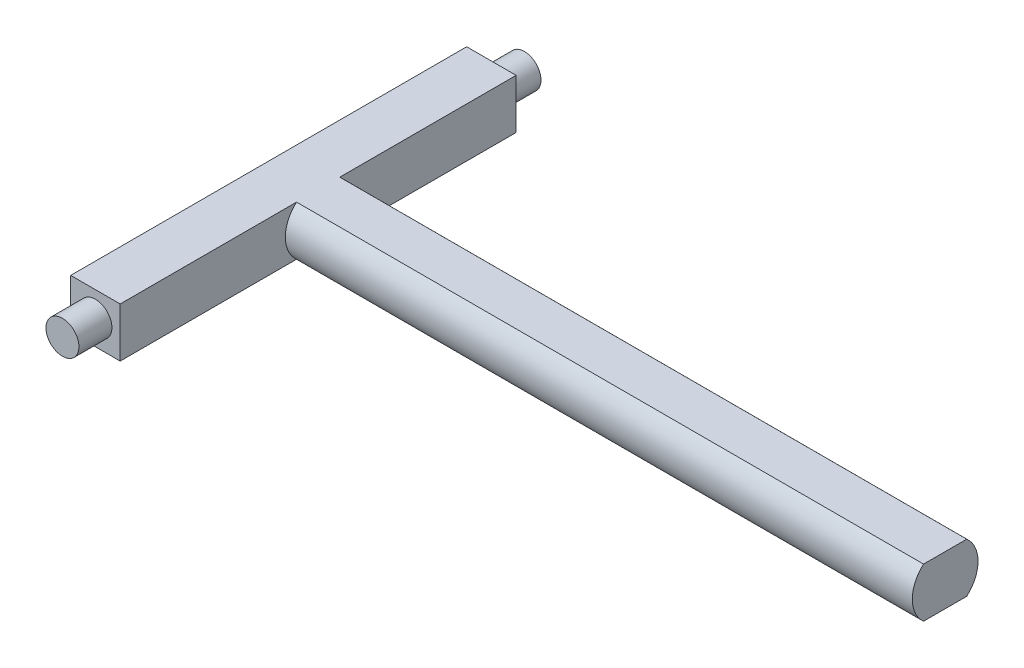
ISO-10303-21;
HEADER;
FILE_DESCRIPTION(('STEP AP214'),'2;1');
FILE_NAME('part.step','',(''),(''),'','','');
FILE_SCHEMA(('AUTOMOTIVE_DESIGN { 1 0 10303 214 1 1 1 1 }'));
ENDSEC;
DATA;
#1=APPLICATION_CONTEXT('core data for automotive mechanical design processes');
#2=APPLICATION_PROTOCOL_DEFINITION('international standard','automotive_design',2000,#1);
#3=PRODUCT_CONTEXT('',#1,'mechanical');
#4=PRODUCT('Part','Part','',(#3));
#5=PRODUCT_RELATED_PRODUCT_CATEGORY('part','',(#4));
#6=PRODUCT_DEFINITION_FORMATION('','',#4);
#7=PRODUCT_DEFINITION_CONTEXT('part definition',#1,'design');
#8=PRODUCT_DEFINITION('design','',#6,#7);
#9=PRODUCT_DEFINITION_SHAPE('','',#8);
#10=(LENGTH_UNIT() NAMED_UNIT(*) SI_UNIT(.MILLI.,.METRE.));
#11=(NAMED_UNIT(*) PLANE_ANGLE_UNIT() SI_UNIT($,.RADIAN.));
#12=(NAMED_UNIT(*) SI_UNIT($,.STERADIAN.) SOLID_ANGLE_UNIT());
#13=UNCERTAINTY_MEASURE_WITH_UNIT(LENGTH_MEASURE(1.E-05),#10,'distance_accuracy_value','');
#14=(GEOMETRIC_REPRESENTATION_CONTEXT(3) GLOBAL_UNCERTAINTY_ASSIGNED_CONTEXT((#13)) GLOBAL_UNIT_ASSIGNED_CONTEXT((#10,
#11,#12)) REPRESENTATION_CONTEXT('',''));
#15=CARTESIAN_POINT('',(0.,0.,0.));
#16=DIRECTION('',(0.,0.,1.));
#17=DIRECTION('',(1.,0.,0.));
#18=AXIS2_PLACEMENT_3D('',#15,#16,#17);
#19=CARTESIAN_POINT('',(38.1,0.,0.));
#20=DIRECTION('',(-1.,0.,0.));
#21=DIRECTION('',(0.,0.,1.));
#22=AXIS2_PLACEMENT_3D('',#19,#20,#21);
#23=PLANE('',#22);
#24=CARTESIAN_POINT('',(38.1,19.05,0.));
#25=DIRECTION('',(1.,0.,0.));
#26=DIRECTION('',(0.,0.,-1.));
#27=AXIS2_PLACEMENT_3D('',#24,#25,#26);
#28=CIRCLE('',#27,25.2842101273256);
#29=CARTESIAN_POINT('',(38.1,38.1,16.624944564201));
#30=VERTEX_POINT('',#29);
#31=CARTESIAN_POINT('',(38.1,0.,16.624944564201));
#32=VERTEX_POINT('',#31);
#33=EDGE_CURVE('E55',#30,#32,#28,.T.);
#34=ORIENTED_EDGE('',*,*,#33,.F.);
#35=DIRECTION('',(0.,0.,1.));
#36=VECTOR('',#35,1.);
#37=CARTESIAN_POINT('',(38.1,38.1,152.4));
#38=LINE('',#37,#36);
#39=CARTESIAN_POINT('',(38.1,38.1,152.4));
#40=VERTEX_POINT('',#39);
#41=EDGE_CURVE('E150',#30,#40,#38,.T.);
#42=ORIENTED_EDGE('',*,*,#41,.T.);
#43=DIRECTION('',(0.,-1.,0.));
#44=VECTOR('',#43,1.);
#45=CARTESIAN_POINT('',(38.1,0.,152.4));
#46=LINE('',#45,#44);
#47=CARTESIAN_POINT('',(38.1,0.,152.4));
#48=VERTEX_POINT('',#47);
#49=EDGE_CURVE('E142',#40,#48,#46,.T.);
#50=ORIENTED_EDGE('',*,*,#49,.T.);
#51=DIRECTION('',(0.,0.,-1.));
#52=VECTOR('',#51,1.);
#53=CARTESIAN_POINT('',(38.1,0.,-152.4));
#54=LINE('',#53,#52);
#55=EDGE_CURVE('E146',#48,#32,#54,.T.);
#56=ORIENTED_EDGE('',*,*,#55,.T.);
#57=EDGE_LOOP('',(#34,#42,#50,#56));
#58=FACE_BOUND('',#57,.T.);
#59=ADVANCED_FACE('F38',(#58),#23,.F.);
#60=CARTESIAN_POINT('',(38.1,0.,152.4));
#61=DIRECTION('',(0.,0.,-1.));
#62=DIRECTION('',(-1.,0.,0.));
#63=AXIS2_PLACEMENT_3D('',#60,#61,#62);
#64=PLANE('',#63);
#65=CARTESIAN_POINT('',(19.05,19.05,152.4));
#66=DIRECTION('',(0.,0.,1.));
#67=DIRECTION('',(1.,0.,0.));
#68=AXIS2_PLACEMENT_3D('',#65,#66,#67);
#69=CIRCLE('',#68,12.6739425858376);
#70=CARTESIAN_POINT('',(31.7239425858376,19.05,152.4));
#71=VERTEX_POINT('',#70);
#72=EDGE_CURVE('E47',#71,#71,#69,.T.);
#73=ORIENTED_EDGE('',*,*,#72,.F.);
#74=EDGE_LOOP('',(#73));
#75=FACE_BOUND('',#74,.T.);
#76=DIRECTION('',(0.,-1.,0.));
#77=VECTOR('',#76,1.);
#78=CARTESIAN_POINT('',(0.,0.,152.4));
#79=LINE('',#78,#77);
#80=CARTESIAN_POINT('',(0.,38.1,152.4));
#81=VERTEX_POINT('',#80);
#82=CARTESIAN_POINT('',(0.,0.,152.4));
#83=VERTEX_POINT('',#82);
#84=EDGE_CURVE('E139',#81,#83,#79,.T.);
#85=ORIENTED_EDGE('',*,*,#84,.T.);
#86=DIRECTION('',(-1.,0.,0.));
#87=VECTOR('',#86,1.);
#88=CARTESIAN_POINT('',(38.1,0.,152.4));
#89=LINE('',#88,#87);
#90=EDGE_CURVE('E42',#48,#83,#89,.T.);
#91=ORIENTED_EDGE('',*,*,#90,.F.);
#92=ORIENTED_EDGE('',*,*,#49,.F.);
#93=DIRECTION('',(-1.,0.,0.));
#94=VECTOR('',#93,1.);
#95=CARTESIAN_POINT('',(38.1,38.1,152.4));
#96=LINE('',#95,#94);
#97=EDGE_CURVE('E153',#40,#81,#96,.T.);
#98=ORIENTED_EDGE('',*,*,#97,.T.);
#99=EDGE_LOOP('',(#85,#91,#92,#98));
#100=FACE_BOUND('',#99,.T.);
#101=ADVANCED_FACE('F40',(#75,#100),#64,.F.);
#102=CARTESIAN_POINT('',(38.1,0.,-152.4));
#103=DIRECTION('',(0.,1.,0.));
#104=DIRECTION('',(0.,0.,1.));
#105=AXIS2_PLACEMENT_3D('',#102,#103,#104);
#106=PLANE('',#105);
#107=DIRECTION('',(0.,0.,-1.));
#108=VECTOR('',#107,1.);
#109=CARTESIAN_POINT('',(0.,0.,-152.4));
#110=LINE('',#109,#108);
#111=CARTESIAN_POINT('',(0.,0.,-152.4));
#112=VERTEX_POINT('',#111);
#113=EDGE_CURVE('E156',#83,#112,#110,.T.);
#114=ORIENTED_EDGE('',*,*,#113,.T.);
#115=DIRECTION('',(-1.,0.,0.));
#116=VECTOR('',#115,1.);
#117=CARTESIAN_POINT('',(38.1,0.,-152.4));
#118=LINE('',#117,#116);
#119=CARTESIAN_POINT('',(38.1,0.,-152.4));
#120=VERTEX_POINT('',#119);
#121=EDGE_CURVE('E165',#120,#112,#118,.T.);
#122=ORIENTED_EDGE('',*,*,#121,.F.);
#123=CARTESIAN_POINT('',(38.1,0.,-16.624944564201));
#124=VERTEX_POINT('',#123);
#125=EDGE_CURVE('E127',#124,#120,#54,.T.);
#126=ORIENTED_EDGE('',*,*,#125,.F.);
#127=DIRECTION('',(-1.,0.,0.));
#128=VECTOR('',#127,1.);
#129=CARTESIAN_POINT('',(520.7,0.,-16.624944564201));
#130=LINE('',#129,#128);
#131=CARTESIAN_POINT('',(520.7,0.,-16.624944564201));
#132=VERTEX_POINT('',#131);
#133=EDGE_CURVE('E109',#132,#124,#130,.T.);
#134=ORIENTED_EDGE('',*,*,#133,.F.);
#135=DIRECTION('',(0.,0.,-1.));
#136=VECTOR('',#135,1.);
#137=CARTESIAN_POINT('',(520.7,0.,0.));
#138=LINE('',#137,#136);
#139=CARTESIAN_POINT('',(520.7,0.,16.624944564201));
#140=VERTEX_POINT('',#139);
#141=EDGE_CURVE('E115',#140,#132,#138,.T.);
#142=ORIENTED_EDGE('',*,*,#141,.F.);
#143=DIRECTION('',(-1.,0.,0.));
#144=VECTOR('',#143,1.);
#145=CARTESIAN_POINT('',(520.7,0.,16.624944564201));
#146=LINE('',#145,#144);
#147=EDGE_CURVE('E190',#140,#32,#146,.T.);
#148=ORIENTED_EDGE('',*,*,#147,.T.);
#149=ORIENTED_EDGE('',*,*,#55,.F.);
#150=ORIENTED_EDGE('',*,*,#90,.T.);
#151=EDGE_LOOP('',(#114,#122,#126,#134,#142,#148,#149,#150));
#152=FACE_BOUND('',#151,.T.);
#153=ADVANCED_FACE('F125',(#152),#106,.F.);
#154=CARTESIAN_POINT('',(38.1,38.0999999999999,-152.4));
#155=DIRECTION('',(0.,0.,1.));
#156=DIRECTION('',(1.,0.,0.));
#157=AXIS2_PLACEMENT_3D('',#154,#155,#156);
#158=PLANE('',#157);
#159=CARTESIAN_POINT('',(19.05,19.05,-152.4));
#160=DIRECTION('',(0.,0.,-1.));
#161=DIRECTION('',(-1.,0.,0.));
#162=AXIS2_PLACEMENT_3D('',#159,#160,#161);
#163=CIRCLE('',#162,12.735920818074);
#164=CARTESIAN_POINT('',(6.31407918192595,19.05,-152.4));
#165=VERTEX_POINT('',#164);
#166=EDGE_CURVE('E11',#165,#165,#163,.T.);
#167=ORIENTED_EDGE('',*,*,#166,.F.);
#168=EDGE_LOOP('',(#167));
#169=FACE_BOUND('',#168,.T.);
#170=DIRECTION('',(0.,1.,0.));
#171=VECTOR('',#170,1.);
#172=CARTESIAN_POINT('',(0.,38.0999999999999,-152.4));
#173=LINE('',#172,#171);
#174=CARTESIAN_POINT('',(0.,38.0999999999999,-152.4));
#175=VERTEX_POINT('',#174);
#176=EDGE_CURVE('E158',#112,#175,#173,.T.);
#177=ORIENTED_EDGE('',*,*,#176,.T.);
#178=DIRECTION('',(-1.,0.,0.));
#179=VECTOR('',#178,1.);
#180=CARTESIAN_POINT('',(38.1,38.0999999999999,-152.4));
#181=LINE('',#180,#179);
#182=CARTESIAN_POINT('',(38.1,38.0999999999999,-152.4));
#183=VERTEX_POINT('',#182);
#184=EDGE_CURVE('E163',#183,#175,#181,.T.);
#185=ORIENTED_EDGE('',*,*,#184,.F.);
#186=DIRECTION('',(0.,1.,0.));
#187=VECTOR('',#186,1.);
#188=CARTESIAN_POINT('',(38.1,38.0999999999999,-152.4));
#189=LINE('',#188,#187);
#190=EDGE_CURVE('E148',#120,#183,#189,.T.);
#191=ORIENTED_EDGE('',*,*,#190,.F.);
#192=ORIENTED_EDGE('',*,*,#121,.T.);
#193=EDGE_LOOP('',(#177,#185,#191,#192));
#194=FACE_BOUND('',#193,.T.);
#195=ADVANCED_FACE('F180',(#169,#194),#158,.F.);
#196=CARTESIAN_POINT('',(38.1,38.1,152.4));
#197=DIRECTION('',(0.,-1.,0.));
#198=DIRECTION('',(0.,0.,-1.));
#199=AXIS2_PLACEMENT_3D('',#196,#197,#198);
#200=PLANE('',#199);
#201=DIRECTION('',(0.,0.,1.));
#202=VECTOR('',#201,1.);
#203=CARTESIAN_POINT('',(0.,38.1,152.4));
#204=LINE('',#203,#202);
#205=EDGE_CURVE('E145',#175,#81,#204,.T.);
#206=ORIENTED_EDGE('',*,*,#205,.T.);
#207=ORIENTED_EDGE('',*,*,#97,.F.);
#208=ORIENTED_EDGE('',*,*,#41,.F.);
#209=DIRECTION('',(-1.,0.,0.));
#210=VECTOR('',#209,1.);
#211=CARTESIAN_POINT('',(520.7,38.1,16.624944564201));
#212=LINE('',#211,#210);
#213=CARTESIAN_POINT('',(520.7,38.1,16.624944564201));
#214=VERTEX_POINT('',#213);
#215=EDGE_CURVE('E133',#214,#30,#212,.T.);
#216=ORIENTED_EDGE('',*,*,#215,.F.);
#217=DIRECTION('',(0.,0.,1.));
#218=VECTOR('',#217,1.);
#219=CARTESIAN_POINT('',(520.7,38.1,0.));
#220=LINE('',#219,#218);
#221=CARTESIAN_POINT('',(520.7,38.1,-16.624944564201));
#222=VERTEX_POINT('',#221);
#223=EDGE_CURVE('E114',#222,#214,#220,.T.);
#224=ORIENTED_EDGE('',*,*,#223,.F.);
#225=DIRECTION('',(-1.,0.,0.));
#226=VECTOR('',#225,1.);
#227=CARTESIAN_POINT('',(520.7,38.1,-16.624944564201));
#228=LINE('',#227,#226);
#229=CARTESIAN_POINT('',(38.1,38.1,-16.624944564201));
#230=VERTEX_POINT('',#229);
#231=EDGE_CURVE('E111',#222,#230,#228,.T.);
#232=ORIENTED_EDGE('',*,*,#231,.T.);
#233=EDGE_CURVE('E151',#183,#230,#38,.T.);
#234=ORIENTED_EDGE('',*,*,#233,.F.);
#235=ORIENTED_EDGE('',*,*,#184,.T.);
#236=EDGE_LOOP('',(#206,#207,#208,#216,#224,#232,#234,#235));
#237=FACE_BOUND('',#236,.T.);
#238=ADVANCED_FACE('F183',(#237),#200,.F.);
#239=CARTESIAN_POINT('',(38.1,19.05,0.));
#240=DIRECTION('',(1.,0.,0.));
#241=DIRECTION('',(0.,0.,-1.));
#242=AXIS2_PLACEMENT_3D('',#239,#240,#241);
#243=CIRCLE('',#242,25.2842101273256);
#244=EDGE_CURVE('E63',#124,#230,#243,.T.);
#245=ORIENTED_EDGE('',*,*,#244,.F.);
#246=ORIENTED_EDGE('',*,*,#125,.T.);
#247=ORIENTED_EDGE('',*,*,#190,.T.);
#248=ORIENTED_EDGE('',*,*,#233,.T.);
#249=EDGE_LOOP('',(#245,#246,#247,#248));
#250=FACE_BOUND('',#249,.T.);
#251=ADVANCED_FACE('F184',(#250),#23,.F.);
#252=CARTESIAN_POINT('',(0.,0.,0.));
#253=DIRECTION('',(-1.,0.,0.));
#254=DIRECTION('',(0.,0.,1.));
#255=AXIS2_PLACEMENT_3D('',#252,#253,#254);
#256=PLANE('',#255);
#257=ORIENTED_EDGE('',*,*,#84,.F.);
#258=ORIENTED_EDGE('',*,*,#205,.F.);
#259=ORIENTED_EDGE('',*,*,#176,.F.);
#260=ORIENTED_EDGE('',*,*,#113,.F.);
#261=EDGE_LOOP('',(#257,#258,#259,#260));
#262=FACE_BOUND('',#261,.T.);
#263=ADVANCED_FACE('F178',(#262),#256,.T.);
#264=CARTESIAN_POINT('',(19.05,19.05,177.8));
#265=DIRECTION('',(0.,0.,-1.));
#266=DIRECTION('',(-1.,0.,0.));
#267=AXIS2_PLACEMENT_3D('',#264,#265,#266);
#268=CYLINDRICAL_SURFACE('',#267,12.6739425858376);
#269=CARTESIAN_POINT('',(19.05,19.05,177.8));
#270=DIRECTION('',(0.,0.,1.));
#271=DIRECTION('',(1.,0.,0.));
#272=AXIS2_PLACEMENT_3D('',#269,#270,#271);
#273=CIRCLE('',#272,12.6739425858376);
#274=CARTESIAN_POINT('',(31.7239425858376,19.05,177.8));
#275=VERTEX_POINT('',#274);
#276=EDGE_CURVE('E131',#275,#275,#273,.T.);
#277=ORIENTED_EDGE('',*,*,#276,.F.);
#278=EDGE_LOOP('',(#277));
#279=FACE_BOUND('',#278,.T.);
#280=ORIENTED_EDGE('',*,*,#72,.T.);
#281=EDGE_LOOP('',(#280));
#282=FACE_BOUND('',#281,.T.);
#283=ADVANCED_FACE('F208',(#279,#282),#268,.T.);
#284=CARTESIAN_POINT('',(0.,0.,177.8));
#285=DIRECTION('',(0.,0.,1.));
#286=DIRECTION('',(1.,0.,0.));
#287=AXIS2_PLACEMENT_3D('',#284,#285,#286);
#288=PLANE('',#287);
#289=ORIENTED_EDGE('',*,*,#276,.T.);
#290=EDGE_LOOP('',(#289));
#291=FACE_BOUND('',#290,.T.);
#292=ADVANCED_FACE('F233',(#291),#288,.T.);
#293=CARTESIAN_POINT('',(19.05,19.05,-177.8));
#294=DIRECTION('',(0.,0.,1.));
#295=DIRECTION('',(1.,0.,0.));
#296=AXIS2_PLACEMENT_3D('',#293,#294,#295);
#297=CYLINDRICAL_SURFACE('',#296,12.735920818074);
#298=CARTESIAN_POINT('',(19.05,19.05,-177.8));
#299=DIRECTION('',(0.,0.,-1.));
#300=DIRECTION('',(-1.,0.,0.));
#301=AXIS2_PLACEMENT_3D('',#298,#299,#300);
#302=CIRCLE('',#301,12.735920818074);
#303=CARTESIAN_POINT('',(6.31407918192595,19.05,-177.8));
#304=VERTEX_POINT('',#303);
#305=EDGE_CURVE('E128',#304,#304,#302,.T.);
#306=ORIENTED_EDGE('',*,*,#305,.F.);
#307=EDGE_LOOP('',(#306));
#308=FACE_BOUND('',#307,.T.);
#309=ORIENTED_EDGE('',*,*,#166,.T.);
#310=EDGE_LOOP('',(#309));
#311=FACE_BOUND('',#310,.T.);
#312=ADVANCED_FACE('F238',(#308,#311),#297,.T.);
#313=CARTESIAN_POINT('',(0.,0.,-177.8));
#314=DIRECTION('',(0.,0.,-1.));
#315=DIRECTION('',(-1.,0.,0.));
#316=AXIS2_PLACEMENT_3D('',#313,#314,#315);
#317=PLANE('',#316);
#318=ORIENTED_EDGE('',*,*,#305,.T.);
#319=EDGE_LOOP('',(#318));
#320=FACE_BOUND('',#319,.T.);
#321=ADVANCED_FACE('F243',(#320),#317,.T.);
#322=CARTESIAN_POINT('',(520.7,19.05,0.));
#323=DIRECTION('',(-1.,0.,0.));
#324=DIRECTION('',(0.,0.,1.));
#325=AXIS2_PLACEMENT_3D('',#322,#323,#324);
#326=CYLINDRICAL_SURFACE('',#325,25.2842101273256);
#327=ORIENTED_EDGE('',*,*,#244,.T.);
#328=ORIENTED_EDGE('',*,*,#231,.F.);
#329=CARTESIAN_POINT('',(520.7,19.05,0.));
#330=DIRECTION('',(1.,0.,0.));
#331=DIRECTION('',(0.,0.,-1.));
#332=AXIS2_PLACEMENT_3D('',#329,#330,#331);
#333=CIRCLE('',#332,25.2842101273256);
#334=EDGE_CURVE('E105',#132,#222,#333,.T.);
#335=ORIENTED_EDGE('',*,*,#334,.F.);
#336=ORIENTED_EDGE('',*,*,#133,.T.);
#337=EDGE_LOOP('',(#327,#328,#335,#336));
#338=FACE_BOUND('',#337,.T.);
#339=ADVANCED_FACE('F107',(#338),#326,.T.);
#340=CARTESIAN_POINT('',(520.7,19.05,0.));
#341=DIRECTION('',(-1.,0.,0.));
#342=DIRECTION('',(0.,0.,1.));
#343=AXIS2_PLACEMENT_3D('',#340,#341,#342);
#344=CYLINDRICAL_SURFACE('',#343,25.2842101273256);
#345=ORIENTED_EDGE('',*,*,#33,.T.);
#346=ORIENTED_EDGE('',*,*,#147,.F.);
#347=CARTESIAN_POINT('',(520.7,19.05,0.));
#348=DIRECTION('',(1.,0.,0.));
#349=DIRECTION('',(0.,0.,-1.));
#350=AXIS2_PLACEMENT_3D('',#347,#348,#349);
#351=CIRCLE('',#350,25.2842101273256);
#352=EDGE_CURVE('E120',#214,#140,#351,.T.);
#353=ORIENTED_EDGE('',*,*,#352,.F.);
#354=ORIENTED_EDGE('',*,*,#215,.T.);
#355=EDGE_LOOP('',(#345,#346,#353,#354));
#356=FACE_BOUND('',#355,.T.);
#357=ADVANCED_FACE('F194',(#356),#344,.T.);
#358=CARTESIAN_POINT('',(520.7,0.,0.));
#359=DIRECTION('',(1.,0.,0.));
#360=DIRECTION('',(0.,0.,-1.));
#361=AXIS2_PLACEMENT_3D('',#358,#359,#360);
#362=PLANE('',#361);
#363=ORIENTED_EDGE('',*,*,#141,.T.);
#364=ORIENTED_EDGE('',*,*,#334,.T.);
#365=ORIENTED_EDGE('',*,*,#223,.T.);
#366=ORIENTED_EDGE('',*,*,#352,.T.);
#367=EDGE_LOOP('',(#363,#364,#365,#366));
#368=FACE_BOUND('',#367,.T.);
#369=ADVANCED_FACE('F118',(#368),#362,.T.);
#370=CLOSED_SHELL('',(#59,#101,#153,#195,#238,#251,#263,#283,#292,#312,#321,#339,#357,#369));
#371=MANIFOLD_SOLID_BREP('B2',#370);
#372=ADVANCED_BREP_SHAPE_REPRESENTATION('',(#18,#371),#14);
#373=SHAPE_DEFINITION_REPRESENTATION(#9,#372);
ENDSEC;
END-ISO-10303-21;
